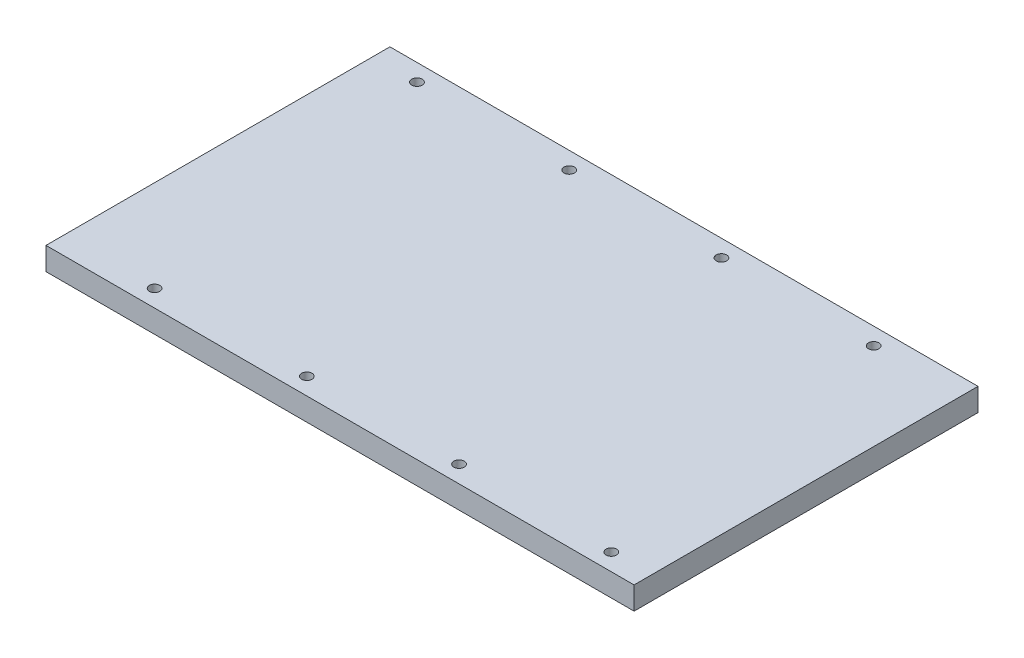
ISO-10303-21;
HEADER;
FILE_DESCRIPTION(('STEP AP214'),'2;1');
FILE_NAME('part.step','',(''),(''),'','','');
FILE_SCHEMA(('AUTOMOTIVE_DESIGN { 1 0 10303 214 1 1 1 1 }'));
ENDSEC;
DATA;
#1=APPLICATION_CONTEXT('core data for automotive mechanical design processes');
#2=APPLICATION_PROTOCOL_DEFINITION('international standard','automotive_design',2000,#1);
#3=PRODUCT_CONTEXT('',#1,'mechanical');
#4=PRODUCT('Part','Part','',(#3));
#5=PRODUCT_RELATED_PRODUCT_CATEGORY('part','',(#4));
#6=PRODUCT_DEFINITION_FORMATION('','',#4);
#7=PRODUCT_DEFINITION_CONTEXT('part definition',#1,'design');
#8=PRODUCT_DEFINITION('design','',#6,#7);
#9=PRODUCT_DEFINITION_SHAPE('','',#8);
#10=(LENGTH_UNIT() NAMED_UNIT(*) SI_UNIT(.MILLI.,.METRE.));
#11=(NAMED_UNIT(*) PLANE_ANGLE_UNIT() SI_UNIT($,.RADIAN.));
#12=(NAMED_UNIT(*) SI_UNIT($,.STERADIAN.) SOLID_ANGLE_UNIT());
#13=UNCERTAINTY_MEASURE_WITH_UNIT(LENGTH_MEASURE(1.E-05),#10,'distance_accuracy_value','');
#14=(GEOMETRIC_REPRESENTATION_CONTEXT(3) GLOBAL_UNCERTAINTY_ASSIGNED_CONTEXT((#13)) GLOBAL_UNIT_ASSIGNED_CONTEXT((#10,
#11,#12)) REPRESENTATION_CONTEXT('',''));
#15=CARTESIAN_POINT('',(0.,0.,0.));
#16=DIRECTION('',(0.,0.,1.));
#17=DIRECTION('',(1.,0.,0.));
#18=AXIS2_PLACEMENT_3D('',#15,#16,#17);
#19=CARTESIAN_POINT('',(0.,12.,0.));
#20=DIRECTION('',(0.,1.,0.));
#21=DIRECTION('',(0.,0.,1.));
#22=AXIS2_PLACEMENT_3D('',#19,#20,#21);
#23=PLANE('',#22);
#24=CARTESIAN_POINT('',(53.75,12.,81.65));
#25=DIRECTION('',(0.,1.,0.));
#26=DIRECTION('',(0.,0.,1.));
#27=AXIS2_PLACEMENT_3D('',#24,#25,#26);
#28=CIRCLE('',#27,2.75);
#29=CARTESIAN_POINT('',(53.75,12.,84.4));
#30=VERTEX_POINT('',#29);
#31=EDGE_CURVE('E151',#30,#30,#28,.T.);
#32=ORIENTED_EDGE('',*,*,#31,.F.);
#33=EDGE_LOOP('',(#32));
#34=FACE_BOUND('',#33,.T.);
#35=CARTESIAN_POINT('',(-106.75,12.,81.65));
#36=DIRECTION('',(0.,1.,0.));
#37=DIRECTION('',(0.,0.,1.));
#38=AXIS2_PLACEMENT_3D('',#35,#36,#37);
#39=CIRCLE('',#38,2.75000000000001);
#40=CARTESIAN_POINT('',(-106.75,12.,84.4));
#41=VERTEX_POINT('',#40);
#42=EDGE_CURVE('E139',#41,#41,#39,.T.);
#43=ORIENTED_EDGE('',*,*,#42,.F.);
#44=EDGE_LOOP('',(#43));
#45=FACE_BOUND('',#44,.T.);
#46=CARTESIAN_POINT('',(28.75,12.,-81.65));
#47=DIRECTION('',(0.,1.,0.));
#48=DIRECTION('',(0.,0.,1.));
#49=AXIS2_PLACEMENT_3D('',#46,#47,#48);
#50=CIRCLE('',#49,2.75);
#51=CARTESIAN_POINT('',(28.75,12.,-78.9));
#52=VERTEX_POINT('',#51);
#53=EDGE_CURVE('E127',#52,#52,#50,.T.);
#54=ORIENTED_EDGE('',*,*,#53,.F.);
#55=EDGE_LOOP('',(#54));
#56=FACE_BOUND('',#55,.T.);
#57=CARTESIAN_POINT('',(-131.75,12.,-81.65));
#58=DIRECTION('',(0.,1.,0.));
#59=DIRECTION('',(0.,0.,1.));
#60=AXIS2_PLACEMENT_3D('',#57,#58,#59);
#61=CIRCLE('',#60,2.75000000000001);
#62=CARTESIAN_POINT('',(-131.75,12.,-78.9));
#63=VERTEX_POINT('',#62);
#64=EDGE_CURVE('E106',#63,#63,#61,.T.);
#65=ORIENTED_EDGE('',*,*,#64,.F.);
#66=EDGE_LOOP('',(#65));
#67=FACE_BOUND('',#66,.T.);
#68=DIRECTION('',(0.,0.,-1.));
#69=VECTOR('',#68,1.);
#70=CARTESIAN_POINT('',(155.,12.,-90.65));
#71=LINE('',#70,#69);
#72=CARTESIAN_POINT('',(155.,12.,90.65));
#73=VERTEX_POINT('',#72);
#74=CARTESIAN_POINT('',(155.,12.,-90.65));
#75=VERTEX_POINT('',#74);
#76=EDGE_CURVE('E91',#73,#75,#71,.T.);
#77=ORIENTED_EDGE('',*,*,#76,.T.);
#78=DIRECTION('',(-1.,0.,0.));
#79=VECTOR('',#78,1.);
#80=CARTESIAN_POINT('',(-155.,12.,-90.65));
#81=LINE('',#80,#79);
#82=CARTESIAN_POINT('',(-155.,12.,-90.65));
#83=VERTEX_POINT('',#82);
#84=EDGE_CURVE('E86',#75,#83,#81,.T.);
#85=ORIENTED_EDGE('',*,*,#84,.T.);
#86=DIRECTION('',(0.,0.,1.));
#87=VECTOR('',#86,1.);
#88=CARTESIAN_POINT('',(-155.,12.,-90.65));
#89=LINE('',#88,#87);
#90=CARTESIAN_POINT('',(-155.,12.,90.65));
#91=VERTEX_POINT('',#90);
#92=EDGE_CURVE('E89',#83,#91,#89,.T.);
#93=ORIENTED_EDGE('',*,*,#92,.T.);
#94=DIRECTION('',(1.,0.,0.));
#95=VECTOR('',#94,1.);
#96=CARTESIAN_POINT('',(-155.,12.,90.65));
#97=LINE('',#96,#95);
#98=EDGE_CURVE('E56',#91,#73,#97,.T.);
#99=ORIENTED_EDGE('',*,*,#98,.T.);
#100=EDGE_LOOP('',(#77,#85,#93,#99));
#101=FACE_BOUND('',#100,.T.);
#102=CARTESIAN_POINT('',(-51.5,12.,-81.65));
#103=DIRECTION('',(0.,1.,0.));
#104=DIRECTION('',(0.,0.,1.));
#105=AXIS2_PLACEMENT_3D('',#102,#103,#104);
#106=CIRCLE('',#105,2.75);
#107=CARTESIAN_POINT('',(-51.5,12.,-78.9));
#108=VERTEX_POINT('',#107);
#109=EDGE_CURVE('E121',#108,#108,#106,.T.);
#110=ORIENTED_EDGE('',*,*,#109,.F.);
#111=EDGE_LOOP('',(#110));
#112=FACE_BOUND('',#111,.T.);
#113=CARTESIAN_POINT('',(109.,12.,-81.65));
#114=DIRECTION('',(0.,1.,0.));
#115=DIRECTION('',(0.,0.,1.));
#116=AXIS2_PLACEMENT_3D('',#113,#114,#115);
#117=CIRCLE('',#116,2.75000000000001);
#118=CARTESIAN_POINT('',(109.,12.,-78.9));
#119=VERTEX_POINT('',#118);
#120=EDGE_CURVE('E133',#119,#119,#117,.T.);
#121=ORIENTED_EDGE('',*,*,#120,.F.);
#122=EDGE_LOOP('',(#121));
#123=FACE_BOUND('',#122,.T.);
#124=CARTESIAN_POINT('',(-26.5,12.,81.65));
#125=DIRECTION('',(0.,1.,0.));
#126=DIRECTION('',(0.,0.,1.));
#127=AXIS2_PLACEMENT_3D('',#124,#125,#126);
#128=CIRCLE('',#127,2.75);
#129=CARTESIAN_POINT('',(-26.5,12.,84.4));
#130=VERTEX_POINT('',#129);
#131=EDGE_CURVE('E145',#130,#130,#128,.T.);
#132=ORIENTED_EDGE('',*,*,#131,.F.);
#133=EDGE_LOOP('',(#132));
#134=FACE_BOUND('',#133,.T.);
#135=CARTESIAN_POINT('',(134.,12.,81.65));
#136=DIRECTION('',(0.,1.,0.));
#137=DIRECTION('',(0.,0.,1.));
#138=AXIS2_PLACEMENT_3D('',#135,#136,#137);
#139=CIRCLE('',#138,2.75000000000001);
#140=CARTESIAN_POINT('',(134.,12.,84.4));
#141=VERTEX_POINT('',#140);
#142=EDGE_CURVE('E157',#141,#141,#139,.T.);
#143=ORIENTED_EDGE('',*,*,#142,.F.);
#144=EDGE_LOOP('',(#143));
#145=FACE_BOUND('',#144,.T.);
#146=ADVANCED_FACE('F39',(#34,#45,#56,#67,#101,#112,#123,#134,#145),#23,.T.);
#147=CARTESIAN_POINT('',(0.,0.,0.));
#148=DIRECTION('',(0.,1.,0.));
#149=DIRECTION('',(0.,0.,1.));
#150=AXIS2_PLACEMENT_3D('',#147,#148,#149);
#151=PLANE('',#150);
#152=DIRECTION('',(0.,0.,-1.));
#153=VECTOR('',#152,1.);
#154=CARTESIAN_POINT('',(155.,0.,-90.65));
#155=LINE('',#154,#153);
#156=CARTESIAN_POINT('',(155.,0.,90.65));
#157=VERTEX_POINT('',#156);
#158=CARTESIAN_POINT('',(155.,0.,-90.65));
#159=VERTEX_POINT('',#158);
#160=EDGE_CURVE('E103',#157,#159,#155,.T.);
#161=ORIENTED_EDGE('',*,*,#160,.F.);
#162=DIRECTION('',(1.,0.,0.));
#163=VECTOR('',#162,1.);
#164=CARTESIAN_POINT('',(-155.,0.,90.65));
#165=LINE('',#164,#163);
#166=CARTESIAN_POINT('',(-155.,0.,90.65));
#167=VERTEX_POINT('',#166);
#168=EDGE_CURVE('E79',#167,#157,#165,.T.);
#169=ORIENTED_EDGE('',*,*,#168,.F.);
#170=DIRECTION('',(0.,0.,1.));
#171=VECTOR('',#170,1.);
#172=CARTESIAN_POINT('',(-155.,0.,-90.65));
#173=LINE('',#172,#171);
#174=CARTESIAN_POINT('',(-155.,0.,-90.65));
#175=VERTEX_POINT('',#174);
#176=EDGE_CURVE('E73',#175,#167,#173,.T.);
#177=ORIENTED_EDGE('',*,*,#176,.F.);
#178=DIRECTION('',(-1.,0.,0.));
#179=VECTOR('',#178,1.);
#180=CARTESIAN_POINT('',(-155.,0.,-90.65));
#181=LINE('',#180,#179);
#182=EDGE_CURVE('E95',#159,#175,#181,.T.);
#183=ORIENTED_EDGE('',*,*,#182,.F.);
#184=EDGE_LOOP('',(#161,#169,#177,#183));
#185=FACE_BOUND('',#184,.T.);
#186=CARTESIAN_POINT('',(-131.75,0.,-81.65));
#187=DIRECTION('',(0.,1.,0.));
#188=DIRECTION('',(0.,0.,1.));
#189=AXIS2_PLACEMENT_3D('',#186,#187,#188);
#190=CIRCLE('',#189,2.75000000000001);
#191=CARTESIAN_POINT('',(-131.75,0.,-78.9));
#192=VERTEX_POINT('',#191);
#193=EDGE_CURVE('E118',#192,#192,#190,.T.);
#194=ORIENTED_EDGE('',*,*,#193,.T.);
#195=EDGE_LOOP('',(#194));
#196=FACE_BOUND('',#195,.T.);
#197=CARTESIAN_POINT('',(-51.5,0.,-81.65));
#198=DIRECTION('',(0.,1.,0.));
#199=DIRECTION('',(0.,0.,1.));
#200=AXIS2_PLACEMENT_3D('',#197,#198,#199);
#201=CIRCLE('',#200,2.75);
#202=CARTESIAN_POINT('',(-51.5,0.,-78.9));
#203=VERTEX_POINT('',#202);
#204=EDGE_CURVE('E124',#203,#203,#201,.T.);
#205=ORIENTED_EDGE('',*,*,#204,.T.);
#206=EDGE_LOOP('',(#205));
#207=FACE_BOUND('',#206,.T.);
#208=CARTESIAN_POINT('',(28.75,0.,-81.65));
#209=DIRECTION('',(0.,1.,0.));
#210=DIRECTION('',(0.,0.,1.));
#211=AXIS2_PLACEMENT_3D('',#208,#209,#210);
#212=CIRCLE('',#211,2.75);
#213=CARTESIAN_POINT('',(28.75,0.,-78.9));
#214=VERTEX_POINT('',#213);
#215=EDGE_CURVE('E130',#214,#214,#212,.T.);
#216=ORIENTED_EDGE('',*,*,#215,.T.);
#217=EDGE_LOOP('',(#216));
#218=FACE_BOUND('',#217,.T.);
#219=CARTESIAN_POINT('',(109.,0.,-81.65));
#220=DIRECTION('',(0.,1.,0.));
#221=DIRECTION('',(0.,0.,1.));
#222=AXIS2_PLACEMENT_3D('',#219,#220,#221);
#223=CIRCLE('',#222,2.75000000000001);
#224=CARTESIAN_POINT('',(109.,0.,-78.9));
#225=VERTEX_POINT('',#224);
#226=EDGE_CURVE('E136',#225,#225,#223,.T.);
#227=ORIENTED_EDGE('',*,*,#226,.T.);
#228=EDGE_LOOP('',(#227));
#229=FACE_BOUND('',#228,.T.);
#230=CARTESIAN_POINT('',(-106.75,0.,81.65));
#231=DIRECTION('',(0.,1.,0.));
#232=DIRECTION('',(0.,0.,1.));
#233=AXIS2_PLACEMENT_3D('',#230,#231,#232);
#234=CIRCLE('',#233,2.75000000000001);
#235=CARTESIAN_POINT('',(-106.75,0.,84.4));
#236=VERTEX_POINT('',#235);
#237=EDGE_CURVE('E142',#236,#236,#234,.T.);
#238=ORIENTED_EDGE('',*,*,#237,.T.);
#239=EDGE_LOOP('',(#238));
#240=FACE_BOUND('',#239,.T.);
#241=CARTESIAN_POINT('',(-26.5,0.,81.65));
#242=DIRECTION('',(0.,1.,0.));
#243=DIRECTION('',(0.,0.,1.));
#244=AXIS2_PLACEMENT_3D('',#241,#242,#243);
#245=CIRCLE('',#244,2.75);
#246=CARTESIAN_POINT('',(-26.5,0.,84.4));
#247=VERTEX_POINT('',#246);
#248=EDGE_CURVE('E148',#247,#247,#245,.T.);
#249=ORIENTED_EDGE('',*,*,#248,.T.);
#250=EDGE_LOOP('',(#249));
#251=FACE_BOUND('',#250,.T.);
#252=CARTESIAN_POINT('',(53.75,0.,81.65));
#253=DIRECTION('',(0.,1.,0.));
#254=DIRECTION('',(0.,0.,1.));
#255=AXIS2_PLACEMENT_3D('',#252,#253,#254);
#256=CIRCLE('',#255,2.75);
#257=CARTESIAN_POINT('',(53.75,0.,84.4));
#258=VERTEX_POINT('',#257);
#259=EDGE_CURVE('E154',#258,#258,#256,.T.);
#260=ORIENTED_EDGE('',*,*,#259,.T.);
#261=EDGE_LOOP('',(#260));
#262=FACE_BOUND('',#261,.T.);
#263=CARTESIAN_POINT('',(134.,0.,81.65));
#264=DIRECTION('',(0.,1.,0.));
#265=DIRECTION('',(0.,0.,1.));
#266=AXIS2_PLACEMENT_3D('',#263,#264,#265);
#267=CIRCLE('',#266,2.75000000000001);
#268=CARTESIAN_POINT('',(134.,0.,84.4));
#269=VERTEX_POINT('',#268);
#270=EDGE_CURVE('E160',#269,#269,#267,.T.);
#271=ORIENTED_EDGE('',*,*,#270,.T.);
#272=EDGE_LOOP('',(#271));
#273=FACE_BOUND('',#272,.T.);
#274=ADVANCED_FACE('F114',(#185,#196,#207,#218,#229,#240,#251,#262,#273),#151,.F.);
#275=CARTESIAN_POINT('',(155.,12.,-90.65));
#276=DIRECTION('',(-1.,0.,0.));
#277=DIRECTION('',(0.,0.,1.));
#278=AXIS2_PLACEMENT_3D('',#275,#276,#277);
#279=PLANE('',#278);
#280=ORIENTED_EDGE('',*,*,#160,.T.);
#281=DIRECTION('',(0.,-1.,0.));
#282=VECTOR('',#281,1.);
#283=CARTESIAN_POINT('',(155.,12.,-90.65));
#284=LINE('',#283,#282);
#285=EDGE_CURVE('E11',#75,#159,#284,.T.);
#286=ORIENTED_EDGE('',*,*,#285,.F.);
#287=ORIENTED_EDGE('',*,*,#76,.F.);
#288=DIRECTION('',(0.,-1.,0.));
#289=VECTOR('',#288,1.);
#290=CARTESIAN_POINT('',(155.,12.,90.65));
#291=LINE('',#290,#289);
#292=EDGE_CURVE('E99',#73,#157,#291,.T.);
#293=ORIENTED_EDGE('',*,*,#292,.T.);
#294=EDGE_LOOP('',(#280,#286,#287,#293));
#295=FACE_BOUND('',#294,.T.);
#296=ADVANCED_FACE('F41',(#295),#279,.F.);
#297=CARTESIAN_POINT('',(-155.,12.,-90.65));
#298=DIRECTION('',(0.,0.,1.));
#299=DIRECTION('',(1.,0.,0.));
#300=AXIS2_PLACEMENT_3D('',#297,#298,#299);
#301=PLANE('',#300);
#302=ORIENTED_EDGE('',*,*,#182,.T.);
#303=DIRECTION('',(0.,-1.,0.));
#304=VECTOR('',#303,1.);
#305=CARTESIAN_POINT('',(-155.,12.,-90.65));
#306=LINE('',#305,#304);
#307=EDGE_CURVE('E48',#83,#175,#306,.T.);
#308=ORIENTED_EDGE('',*,*,#307,.F.);
#309=ORIENTED_EDGE('',*,*,#84,.F.);
#310=ORIENTED_EDGE('',*,*,#285,.T.);
#311=EDGE_LOOP('',(#302,#308,#309,#310));
#312=FACE_BOUND('',#311,.T.);
#313=ADVANCED_FACE('F94',(#312),#301,.F.);
#314=CARTESIAN_POINT('',(-155.,12.,-90.65));
#315=DIRECTION('',(1.,0.,0.));
#316=DIRECTION('',(0.,0.,-1.));
#317=AXIS2_PLACEMENT_3D('',#314,#315,#316);
#318=PLANE('',#317);
#319=ORIENTED_EDGE('',*,*,#176,.T.);
#320=DIRECTION('',(0.,-1.,0.));
#321=VECTOR('',#320,1.);
#322=CARTESIAN_POINT('',(-155.,12.,90.65));
#323=LINE('',#322,#321);
#324=EDGE_CURVE('E96',#91,#167,#323,.T.);
#325=ORIENTED_EDGE('',*,*,#324,.F.);
#326=ORIENTED_EDGE('',*,*,#92,.F.);
#327=ORIENTED_EDGE('',*,*,#307,.T.);
#328=EDGE_LOOP('',(#319,#325,#326,#327));
#329=FACE_BOUND('',#328,.T.);
#330=ADVANCED_FACE('F97',(#329),#318,.F.);
#331=CARTESIAN_POINT('',(-155.,12.,90.65));
#332=DIRECTION('',(0.,0.,-1.));
#333=DIRECTION('',(-1.,0.,0.));
#334=AXIS2_PLACEMENT_3D('',#331,#332,#333);
#335=PLANE('',#334);
#336=ORIENTED_EDGE('',*,*,#168,.T.);
#337=ORIENTED_EDGE('',*,*,#292,.F.);
#338=ORIENTED_EDGE('',*,*,#98,.F.);
#339=ORIENTED_EDGE('',*,*,#324,.T.);
#340=EDGE_LOOP('',(#336,#337,#338,#339));
#341=FACE_BOUND('',#340,.T.);
#342=ADVANCED_FACE('F111',(#341),#335,.F.);
#343=CARTESIAN_POINT('',(-131.75,12.,-81.65));
#344=DIRECTION('',(0.,-1.,0.));
#345=DIRECTION('',(0.,0.,-1.));
#346=AXIS2_PLACEMENT_3D('',#343,#344,#345);
#347=CYLINDRICAL_SURFACE('',#346,2.75000000000001);
#348=ORIENTED_EDGE('',*,*,#64,.T.);
#349=EDGE_LOOP('',(#348));
#350=FACE_BOUND('',#349,.T.);
#351=ORIENTED_EDGE('',*,*,#193,.F.);
#352=EDGE_LOOP('',(#351));
#353=FACE_BOUND('',#352,.T.);
#354=ADVANCED_FACE('F179',(#350,#353),#347,.F.);
#355=CARTESIAN_POINT('',(-51.5,12.,-81.65));
#356=DIRECTION('',(0.,-1.,0.));
#357=DIRECTION('',(0.,0.,-1.));
#358=AXIS2_PLACEMENT_3D('',#355,#356,#357);
#359=CYLINDRICAL_SURFACE('',#358,2.75);
#360=ORIENTED_EDGE('',*,*,#109,.T.);
#361=EDGE_LOOP('',(#360));
#362=FACE_BOUND('',#361,.T.);
#363=ORIENTED_EDGE('',*,*,#204,.F.);
#364=EDGE_LOOP('',(#363));
#365=FACE_BOUND('',#364,.T.);
#366=ADVANCED_FACE('F224',(#362,#365),#359,.F.);
#367=CARTESIAN_POINT('',(28.75,12.,-81.65));
#368=DIRECTION('',(0.,-1.,0.));
#369=DIRECTION('',(0.,0.,-1.));
#370=AXIS2_PLACEMENT_3D('',#367,#368,#369);
#371=CYLINDRICAL_SURFACE('',#370,2.75);
#372=ORIENTED_EDGE('',*,*,#53,.T.);
#373=EDGE_LOOP('',(#372));
#374=FACE_BOUND('',#373,.T.);
#375=ORIENTED_EDGE('',*,*,#215,.F.);
#376=EDGE_LOOP('',(#375));
#377=FACE_BOUND('',#376,.T.);
#378=ADVANCED_FACE('F232',(#374,#377),#371,.F.);
#379=CARTESIAN_POINT('',(109.,12.,-81.65));
#380=DIRECTION('',(0.,-1.,0.));
#381=DIRECTION('',(0.,0.,-1.));
#382=AXIS2_PLACEMENT_3D('',#379,#380,#381);
#383=CYLINDRICAL_SURFACE('',#382,2.75000000000001);
#384=ORIENTED_EDGE('',*,*,#120,.T.);
#385=EDGE_LOOP('',(#384));
#386=FACE_BOUND('',#385,.T.);
#387=ORIENTED_EDGE('',*,*,#226,.F.);
#388=EDGE_LOOP('',(#387));
#389=FACE_BOUND('',#388,.T.);
#390=ADVANCED_FACE('F240',(#386,#389),#383,.F.);
#391=CARTESIAN_POINT('',(-106.75,12.,81.65));
#392=DIRECTION('',(0.,-1.,0.));
#393=DIRECTION('',(0.,0.,-1.));
#394=AXIS2_PLACEMENT_3D('',#391,#392,#393);
#395=CYLINDRICAL_SURFACE('',#394,2.75000000000001);
#396=ORIENTED_EDGE('',*,*,#42,.T.);
#397=EDGE_LOOP('',(#396));
#398=FACE_BOUND('',#397,.T.);
#399=ORIENTED_EDGE('',*,*,#237,.F.);
#400=EDGE_LOOP('',(#399));
#401=FACE_BOUND('',#400,.T.);
#402=ADVANCED_FACE('F249',(#398,#401),#395,.F.);
#403=CARTESIAN_POINT('',(-26.5,12.,81.65));
#404=DIRECTION('',(0.,-1.,0.));
#405=DIRECTION('',(0.,0.,-1.));
#406=AXIS2_PLACEMENT_3D('',#403,#404,#405);
#407=CYLINDRICAL_SURFACE('',#406,2.75);
#408=ORIENTED_EDGE('',*,*,#131,.T.);
#409=EDGE_LOOP('',(#408));
#410=FACE_BOUND('',#409,.T.);
#411=ORIENTED_EDGE('',*,*,#248,.F.);
#412=EDGE_LOOP('',(#411));
#413=FACE_BOUND('',#412,.T.);
#414=ADVANCED_FACE('F258',(#410,#413),#407,.F.);
#415=CARTESIAN_POINT('',(53.75,12.,81.65));
#416=DIRECTION('',(0.,-1.,0.));
#417=DIRECTION('',(0.,0.,-1.));
#418=AXIS2_PLACEMENT_3D('',#415,#416,#417);
#419=CYLINDRICAL_SURFACE('',#418,2.75);
#420=ORIENTED_EDGE('',*,*,#31,.T.);
#421=EDGE_LOOP('',(#420));
#422=FACE_BOUND('',#421,.T.);
#423=ORIENTED_EDGE('',*,*,#259,.F.);
#424=EDGE_LOOP('',(#423));
#425=FACE_BOUND('',#424,.T.);
#426=ADVANCED_FACE('F267',(#422,#425),#419,.F.);
#427=CARTESIAN_POINT('',(134.,12.,81.65));
#428=DIRECTION('',(0.,-1.,0.));
#429=DIRECTION('',(0.,0.,-1.));
#430=AXIS2_PLACEMENT_3D('',#427,#428,#429);
#431=CYLINDRICAL_SURFACE('',#430,2.75000000000001);
#432=ORIENTED_EDGE('',*,*,#142,.T.);
#433=EDGE_LOOP('',(#432));
#434=FACE_BOUND('',#433,.T.);
#435=ORIENTED_EDGE('',*,*,#270,.F.);
#436=EDGE_LOOP('',(#435));
#437=FACE_BOUND('',#436,.T.);
#438=ADVANCED_FACE('F166',(#434,#437),#431,.F.);
#439=CLOSED_SHELL('',(#146,#274,#296,#313,#330,#342,#354,#366,#378,#390,#402,#414,#426,#438));
#440=MANIFOLD_SOLID_BREP('B2',#439);
#441=ADVANCED_BREP_SHAPE_REPRESENTATION('',(#18,#440),#14);
#442=SHAPE_DEFINITION_REPRESENTATION(#9,#441);
ENDSEC;
END-ISO-10303-21;
